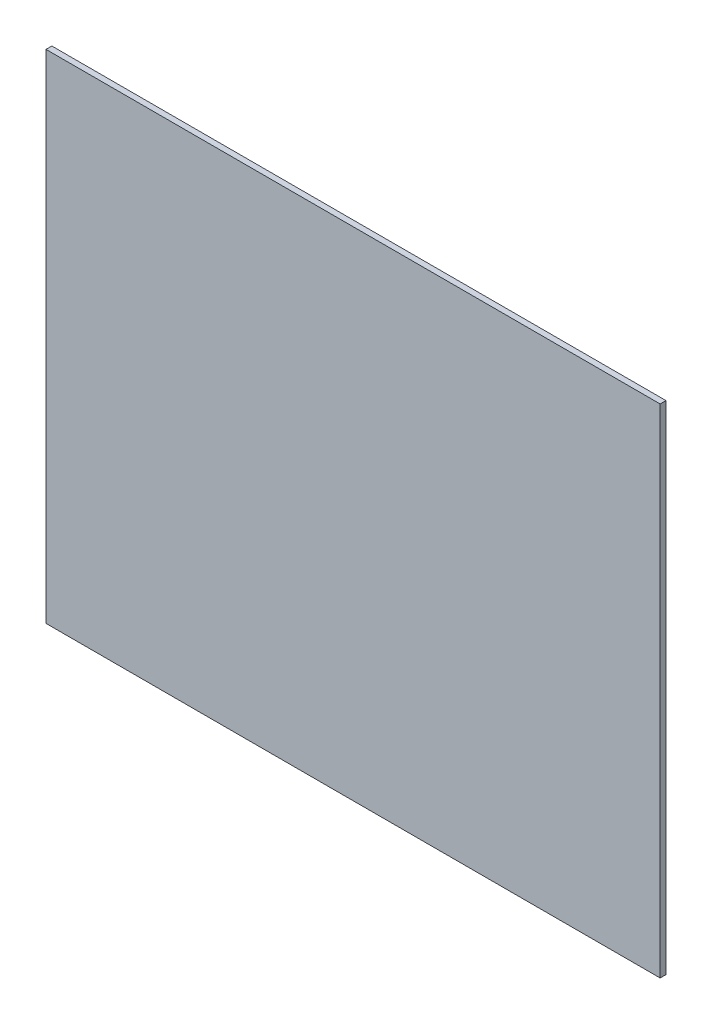
ISO-10303-21;
HEADER;
FILE_DESCRIPTION(('STEP AP214'),'2;1');
FILE_NAME('part.step','',(''),(''),'','','');
FILE_SCHEMA(('AUTOMOTIVE_DESIGN { 1 0 10303 214 1 1 1 1 }'));
ENDSEC;
DATA;
#1=APPLICATION_CONTEXT('core data for automotive mechanical design processes');
#2=APPLICATION_PROTOCOL_DEFINITION('international standard','automotive_design',2000,#1);
#3=PRODUCT_CONTEXT('',#1,'mechanical');
#4=PRODUCT('Part','Part','',(#3));
#5=PRODUCT_RELATED_PRODUCT_CATEGORY('part','',(#4));
#6=PRODUCT_DEFINITION_FORMATION('','',#4);
#7=PRODUCT_DEFINITION_CONTEXT('part definition',#1,'design');
#8=PRODUCT_DEFINITION('design','',#6,#7);
#9=PRODUCT_DEFINITION_SHAPE('','',#8);
#10=(LENGTH_UNIT() NAMED_UNIT(*) SI_UNIT(.MILLI.,.METRE.));
#11=(NAMED_UNIT(*) PLANE_ANGLE_UNIT() SI_UNIT($,.RADIAN.));
#12=(NAMED_UNIT(*) SI_UNIT($,.STERADIAN.) SOLID_ANGLE_UNIT());
#13=UNCERTAINTY_MEASURE_WITH_UNIT(LENGTH_MEASURE(1.E-05),#10,'distance_accuracy_value','');
#14=(GEOMETRIC_REPRESENTATION_CONTEXT(3) GLOBAL_UNCERTAINTY_ASSIGNED_CONTEXT((#13)) GLOBAL_UNIT_ASSIGNED_CONTEXT((#10,
#11,#12)) REPRESENTATION_CONTEXT('',''));
#15=CARTESIAN_POINT('',(0.,0.,0.));
#16=DIRECTION('',(0.,0.,1.));
#17=DIRECTION('',(1.,0.,0.));
#18=AXIS2_PLACEMENT_3D('',#15,#16,#17);
#19=CARTESIAN_POINT('',(-105.,-85.,2.));
#20=DIRECTION('',(1.,0.,0.));
#21=DIRECTION('',(0.,0.,-1.));
#22=AXIS2_PLACEMENT_3D('',#19,#20,#21);
#23=PLANE('',#22);
#24=DIRECTION('',(0.,-1.,0.));
#25=VECTOR('',#24,1.);
#26=CARTESIAN_POINT('',(-105.,-85.,0.));
#27=LINE('',#26,#25);
#28=CARTESIAN_POINT('',(-105.,85.,0.));
#29=VERTEX_POINT('',#28);
#30=CARTESIAN_POINT('',(-105.,-85.,0.));
#31=VERTEX_POINT('',#30);
#32=EDGE_CURVE('E96',#29,#31,#27,.T.);
#33=ORIENTED_EDGE('',*,*,#32,.T.);
#34=DIRECTION('',(0.,0.,-1.));
#35=VECTOR('',#34,1.);
#36=CARTESIAN_POINT('',(-105.,-85.,2.));
#37=LINE('',#36,#35);
#38=CARTESIAN_POINT('',(-105.,-85.,2.));
#39=VERTEX_POINT('',#38);
#40=EDGE_CURVE('E11',#39,#31,#37,.T.);
#41=ORIENTED_EDGE('',*,*,#40,.F.);
#42=DIRECTION('',(0.,-1.,0.));
#43=VECTOR('',#42,1.);
#44=CARTESIAN_POINT('',(-105.,-85.,2.));
#45=LINE('',#44,#43);
#46=CARTESIAN_POINT('',(-105.,85.,2.));
#47=VERTEX_POINT('',#46);
#48=EDGE_CURVE('E84',#47,#39,#45,.T.);
#49=ORIENTED_EDGE('',*,*,#48,.F.);
#50=DIRECTION('',(0.,0.,-1.));
#51=VECTOR('',#50,1.);
#52=CARTESIAN_POINT('',(-105.,85.,2.));
#53=LINE('',#52,#51);
#54=EDGE_CURVE('E92',#47,#29,#53,.T.);
#55=ORIENTED_EDGE('',*,*,#54,.T.);
#56=EDGE_LOOP('',(#33,#41,#49,#55));
#57=FACE_BOUND('',#56,.T.);
#58=ADVANCED_FACE('F33',(#57),#23,.F.);
#59=CARTESIAN_POINT('',(105.,-85.,2.));
#60=DIRECTION('',(0.,1.,0.));
#61=DIRECTION('',(-1.,0.,0.));
#62=AXIS2_PLACEMENT_3D('',#59,#60,#61);
#63=PLANE('',#62);
#64=DIRECTION('',(1.,0.,0.));
#65=VECTOR('',#64,1.);
#66=CARTESIAN_POINT('',(105.,-85.,0.));
#67=LINE('',#66,#65);
#68=CARTESIAN_POINT('',(105.,-85.,0.));
#69=VERTEX_POINT('',#68);
#70=EDGE_CURVE('E88',#31,#69,#67,.T.);
#71=ORIENTED_EDGE('',*,*,#70,.T.);
#72=DIRECTION('',(0.,0.,-1.));
#73=VECTOR('',#72,1.);
#74=CARTESIAN_POINT('',(105.,-85.,2.));
#75=LINE('',#74,#73);
#76=CARTESIAN_POINT('',(105.,-85.,2.));
#77=VERTEX_POINT('',#76);
#78=EDGE_CURVE('E41',#77,#69,#75,.T.);
#79=ORIENTED_EDGE('',*,*,#78,.F.);
#80=DIRECTION('',(1.,0.,0.));
#81=VECTOR('',#80,1.);
#82=CARTESIAN_POINT('',(105.,-85.,2.));
#83=LINE('',#82,#81);
#84=EDGE_CURVE('E79',#39,#77,#83,.T.);
#85=ORIENTED_EDGE('',*,*,#84,.F.);
#86=ORIENTED_EDGE('',*,*,#40,.T.);
#87=EDGE_LOOP('',(#71,#79,#85,#86));
#88=FACE_BOUND('',#87,.T.);
#89=ADVANCED_FACE('F87',(#88),#63,.F.);
#90=CARTESIAN_POINT('',(105.,-85.,2.));
#91=DIRECTION('',(-1.,0.,0.));
#92=DIRECTION('',(0.,0.,1.));
#93=AXIS2_PLACEMENT_3D('',#90,#91,#92);
#94=PLANE('',#93);
#95=DIRECTION('',(0.,1.,0.));
#96=VECTOR('',#95,1.);
#97=CARTESIAN_POINT('',(105.,-85.,0.));
#98=LINE('',#97,#96);
#99=CARTESIAN_POINT('',(105.,85.,0.));
#100=VERTEX_POINT('',#99);
#101=EDGE_CURVE('E66',#69,#100,#98,.T.);
#102=ORIENTED_EDGE('',*,*,#101,.T.);
#103=DIRECTION('',(0.,0.,-1.));
#104=VECTOR('',#103,1.);
#105=CARTESIAN_POINT('',(105.,85.,2.));
#106=LINE('',#105,#104);
#107=CARTESIAN_POINT('',(105.,85.,2.));
#108=VERTEX_POINT('',#107);
#109=EDGE_CURVE('E89',#108,#100,#106,.T.);
#110=ORIENTED_EDGE('',*,*,#109,.F.);
#111=DIRECTION('',(0.,1.,0.));
#112=VECTOR('',#111,1.);
#113=CARTESIAN_POINT('',(105.,-85.,2.));
#114=LINE('',#113,#112);
#115=EDGE_CURVE('E82',#77,#108,#114,.T.);
#116=ORIENTED_EDGE('',*,*,#115,.F.);
#117=ORIENTED_EDGE('',*,*,#78,.T.);
#118=EDGE_LOOP('',(#102,#110,#116,#117));
#119=FACE_BOUND('',#118,.T.);
#120=ADVANCED_FACE('F90',(#119),#94,.F.);
#121=CARTESIAN_POINT('',(105.,85.,2.));
#122=DIRECTION('',(0.,-1.,0.));
#123=DIRECTION('',(1.,0.,0.));
#124=AXIS2_PLACEMENT_3D('',#121,#122,#123);
#125=PLANE('',#124);
#126=DIRECTION('',(-1.,0.,0.));
#127=VECTOR('',#126,1.);
#128=CARTESIAN_POINT('',(105.,85.,0.));
#129=LINE('',#128,#127);
#130=EDGE_CURVE('E72',#100,#29,#129,.T.);
#131=ORIENTED_EDGE('',*,*,#130,.T.);
#132=ORIENTED_EDGE('',*,*,#54,.F.);
#133=DIRECTION('',(-1.,0.,0.));
#134=VECTOR('',#133,1.);
#135=CARTESIAN_POINT('',(105.,85.,2.));
#136=LINE('',#135,#134);
#137=EDGE_CURVE('E49',#108,#47,#136,.T.);
#138=ORIENTED_EDGE('',*,*,#137,.F.);
#139=ORIENTED_EDGE('',*,*,#109,.T.);
#140=EDGE_LOOP('',(#131,#132,#138,#139));
#141=FACE_BOUND('',#140,.T.);
#142=ADVANCED_FACE('F103',(#141),#125,.F.);
#143=CARTESIAN_POINT('',(0.,0.,2.));
#144=DIRECTION('',(0.,0.,1.));
#145=DIRECTION('',(1.,0.,0.));
#146=AXIS2_PLACEMENT_3D('',#143,#144,#145);
#147=PLANE('',#146);
#148=ORIENTED_EDGE('',*,*,#48,.T.);
#149=ORIENTED_EDGE('',*,*,#84,.T.);
#150=ORIENTED_EDGE('',*,*,#115,.T.);
#151=ORIENTED_EDGE('',*,*,#137,.T.);
#152=EDGE_LOOP('',(#148,#149,#150,#151));
#153=FACE_BOUND('',#152,.T.);
#154=ADVANCED_FACE('F80',(#153),#147,.T.);
#155=CARTESIAN_POINT('',(0.,0.,0.));
#156=DIRECTION('',(0.,0.,1.));
#157=DIRECTION('',(1.,0.,0.));
#158=AXIS2_PLACEMENT_3D('',#155,#156,#157);
#159=PLANE('',#158);
#160=ORIENTED_EDGE('',*,*,#32,.F.);
#161=ORIENTED_EDGE('',*,*,#130,.F.);
#162=ORIENTED_EDGE('',*,*,#101,.F.);
#163=ORIENTED_EDGE('',*,*,#70,.F.);
#164=EDGE_LOOP('',(#160,#161,#162,#163));
#165=FACE_BOUND('',#164,.T.);
#166=ADVANCED_FACE('F106',(#165),#159,.F.);
#167=CLOSED_SHELL('',(#58,#89,#120,#142,#154,#166));
#168=MANIFOLD_SOLID_BREP('B2',#167);
#169=ADVANCED_BREP_SHAPE_REPRESENTATION('',(#18,#168),#14);
#170=SHAPE_DEFINITION_REPRESENTATION(#9,#169);
ENDSEC;
END-ISO-10303-21;
